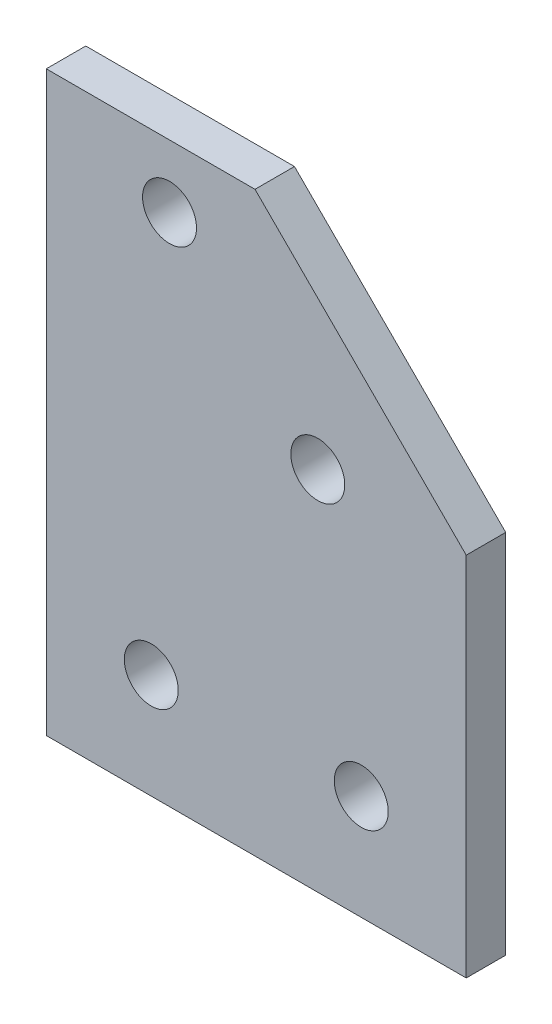
ISO-10303-21;
HEADER;
FILE_DESCRIPTION(('STEP AP214'),'2;1');
FILE_NAME('part.step','',(''),(''),'','','');
FILE_SCHEMA(('AUTOMOTIVE_DESIGN { 1 0 10303 214 1 1 1 1 }'));
ENDSEC;
DATA;
#1=APPLICATION_CONTEXT('core data for automotive mechanical design processes');
#2=APPLICATION_PROTOCOL_DEFINITION('international standard','automotive_design',2000,#1);
#3=PRODUCT_CONTEXT('',#1,'mechanical');
#4=PRODUCT('Part','Part','',(#3));
#5=PRODUCT_RELATED_PRODUCT_CATEGORY('part','',(#4));
#6=PRODUCT_DEFINITION_FORMATION('','',#4);
#7=PRODUCT_DEFINITION_CONTEXT('part definition',#1,'design');
#8=PRODUCT_DEFINITION('design','',#6,#7);
#9=PRODUCT_DEFINITION_SHAPE('','',#8);
#10=(LENGTH_UNIT() NAMED_UNIT(*) SI_UNIT(.MILLI.,.METRE.));
#11=(NAMED_UNIT(*) PLANE_ANGLE_UNIT() SI_UNIT($,.RADIAN.));
#12=(NAMED_UNIT(*) SI_UNIT($,.STERADIAN.) SOLID_ANGLE_UNIT());
#13=UNCERTAINTY_MEASURE_WITH_UNIT(LENGTH_MEASURE(1.E-05),#10,'distance_accuracy_value','');
#14=(GEOMETRIC_REPRESENTATION_CONTEXT(3) GLOBAL_UNCERTAINTY_ASSIGNED_CONTEXT((#13)) GLOBAL_UNIT_ASSIGNED_CONTEXT((#10,
#11,#12)) REPRESENTATION_CONTEXT('',''));
#15=CARTESIAN_POINT('',(0.,0.,0.));
#16=DIRECTION('',(0.,0.,1.));
#17=DIRECTION('',(1.,0.,0.));
#18=AXIS2_PLACEMENT_3D('',#15,#16,#17);
#19=CARTESIAN_POINT('',(25.4,-34.925,-2.3876));
#20=DIRECTION('',(1.,0.,0.));
#21=DIRECTION('',(0.,1.,0.));
#22=AXIS2_PLACEMENT_3D('',#19,#20,#21);
#23=PLANE('',#22);
#24=DIRECTION('',(0.,1.,0.));
#25=VECTOR('',#24,1.);
#26=CARTESIAN_POINT('',(25.4,-34.925,2.3876));
#27=LINE('',#26,#25);
#28=CARTESIAN_POINT('',(25.4,-34.925,2.3876));
#29=VERTEX_POINT('',#28);
#30=CARTESIAN_POINT('',(25.4,9.37259999999999,2.3876));
#31=VERTEX_POINT('',#30);
#32=EDGE_CURVE('E109',#29,#31,#27,.T.);
#33=ORIENTED_EDGE('',*,*,#32,.F.);
#34=DIRECTION('',(0.,0.,1.));
#35=VECTOR('',#34,1.);
#36=CARTESIAN_POINT('',(25.4,-34.925,-2.3876));
#37=LINE('',#36,#35);
#38=CARTESIAN_POINT('',(25.4,-34.925,-2.3876));
#39=VERTEX_POINT('',#38);
#40=EDGE_CURVE('E11',#39,#29,#37,.T.);
#41=ORIENTED_EDGE('',*,*,#40,.F.);
#42=DIRECTION('',(0.,1.,0.));
#43=VECTOR('',#42,1.);
#44=CARTESIAN_POINT('',(25.4,-34.925,-2.3876));
#45=LINE('',#44,#43);
#46=CARTESIAN_POINT('',(25.4,9.37259999999999,-2.3876));
#47=VERTEX_POINT('',#46);
#48=EDGE_CURVE('E104',#39,#47,#45,.T.);
#49=ORIENTED_EDGE('',*,*,#48,.T.);
#50=DIRECTION('',(0.,0.,1.));
#51=VECTOR('',#50,1.);
#52=CARTESIAN_POINT('',(25.4,9.37259999999999,-2.3876));
#53=LINE('',#52,#51);
#54=EDGE_CURVE('E35',#47,#31,#53,.T.);
#55=ORIENTED_EDGE('',*,*,#54,.T.);
#56=EDGE_LOOP('',(#33,#41,#49,#55));
#57=FACE_BOUND('',#56,.T.);
#58=ADVANCED_FACE('F32',(#57),#23,.T.);
#59=CARTESIAN_POINT('',(-25.4,-34.925,-2.3876));
#60=DIRECTION('',(0.,-1.,0.));
#61=DIRECTION('',(0.,0.,-1.));
#62=AXIS2_PLACEMENT_3D('',#59,#60,#61);
#63=PLANE('',#62);
#64=DIRECTION('',(1.,0.,0.));
#65=VECTOR('',#64,1.);
#66=CARTESIAN_POINT('',(-25.4,-34.925,2.3876));
#67=LINE('',#66,#65);
#68=CARTESIAN_POINT('',(-25.4,-34.925,2.3876));
#69=VERTEX_POINT('',#68);
#70=EDGE_CURVE('E119',#69,#29,#67,.T.);
#71=ORIENTED_EDGE('',*,*,#70,.F.);
#72=DIRECTION('',(0.,0.,1.));
#73=VECTOR('',#72,1.);
#74=CARTESIAN_POINT('',(-25.4,-34.925,-2.3876));
#75=LINE('',#74,#73);
#76=CARTESIAN_POINT('',(-25.4,-34.925,-2.3876));
#77=VERTEX_POINT('',#76);
#78=EDGE_CURVE('E41',#77,#69,#75,.T.);
#79=ORIENTED_EDGE('',*,*,#78,.F.);
#80=DIRECTION('',(1.,0.,0.));
#81=VECTOR('',#80,1.);
#82=CARTESIAN_POINT('',(-25.4,-34.925,-2.3876));
#83=LINE('',#82,#81);
#84=EDGE_CURVE('E99',#77,#39,#83,.T.);
#85=ORIENTED_EDGE('',*,*,#84,.T.);
#86=ORIENTED_EDGE('',*,*,#40,.T.);
#87=EDGE_LOOP('',(#71,#79,#85,#86));
#88=FACE_BOUND('',#87,.T.);
#89=ADVANCED_FACE('F125',(#88),#63,.T.);
#90=CARTESIAN_POINT('',(-25.4,34.925,-2.3876));
#91=DIRECTION('',(-1.,0.,0.));
#92=DIRECTION('',(0.,0.,1.));
#93=AXIS2_PLACEMENT_3D('',#90,#91,#92);
#94=PLANE('',#93);
#95=DIRECTION('',(0.,-1.,0.));
#96=VECTOR('',#95,1.);
#97=CARTESIAN_POINT('',(-25.4,34.925,2.3876));
#98=LINE('',#97,#96);
#99=CARTESIAN_POINT('',(-25.4,34.925,2.3876));
#100=VERTEX_POINT('',#99);
#101=EDGE_CURVE('E88',#100,#69,#98,.T.);
#102=ORIENTED_EDGE('',*,*,#101,.F.);
#103=DIRECTION('',(0.,0.,1.));
#104=VECTOR('',#103,1.);
#105=CARTESIAN_POINT('',(-25.4,34.925,-2.3876));
#106=LINE('',#105,#104);
#107=CARTESIAN_POINT('',(-25.4,34.925,-2.3876));
#108=VERTEX_POINT('',#107);
#109=EDGE_CURVE('E83',#108,#100,#106,.T.);
#110=ORIENTED_EDGE('',*,*,#109,.F.);
#111=DIRECTION('',(0.,-1.,0.));
#112=VECTOR('',#111,1.);
#113=CARTESIAN_POINT('',(-25.4,34.925,-2.3876));
#114=LINE('',#113,#112);
#115=EDGE_CURVE('E86',#108,#77,#114,.T.);
#116=ORIENTED_EDGE('',*,*,#115,.T.);
#117=ORIENTED_EDGE('',*,*,#78,.T.);
#118=EDGE_LOOP('',(#102,#110,#116,#117));
#119=FACE_BOUND('',#118,.T.);
#120=ADVANCED_FACE('F85',(#119),#94,.T.);
#121=CARTESIAN_POINT('',(-0.15239999999999,34.925,-2.3876));
#122=DIRECTION('',(0.,1.,0.));
#123=DIRECTION('',(0.,0.,1.));
#124=AXIS2_PLACEMENT_3D('',#121,#122,#123);
#125=PLANE('',#124);
#126=DIRECTION('',(-1.,0.,0.));
#127=VECTOR('',#126,1.);
#128=CARTESIAN_POINT('',(-0.15239999999999,34.925,2.3876));
#129=LINE('',#128,#127);
#130=CARTESIAN_POINT('',(-0.15239999999999,34.925,2.3876));
#131=VERTEX_POINT('',#130);
#132=EDGE_CURVE('E116',#131,#100,#129,.T.);
#133=ORIENTED_EDGE('',*,*,#132,.F.);
#134=DIRECTION('',(0.,0.,1.));
#135=VECTOR('',#134,1.);
#136=CARTESIAN_POINT('',(-0.15239999999999,34.925,-2.3876));
#137=LINE('',#136,#135);
#138=CARTESIAN_POINT('',(-0.15239999999999,34.925,-2.3876));
#139=VERTEX_POINT('',#138);
#140=EDGE_CURVE('E93',#139,#131,#137,.T.);
#141=ORIENTED_EDGE('',*,*,#140,.F.);
#142=DIRECTION('',(-1.,0.,0.));
#143=VECTOR('',#142,1.);
#144=CARTESIAN_POINT('',(-0.15239999999999,34.925,-2.3876));
#145=LINE('',#144,#143);
#146=EDGE_CURVE('E98',#139,#108,#145,.T.);
#147=ORIENTED_EDGE('',*,*,#146,.T.);
#148=ORIENTED_EDGE('',*,*,#109,.T.);
#149=EDGE_LOOP('',(#133,#141,#147,#148));
#150=FACE_BOUND('',#149,.T.);
#151=ADVANCED_FACE('F101',(#150),#125,.T.);
#152=CARTESIAN_POINT('',(25.4,9.37259999999999,-2.3876));
#153=DIRECTION('',(0.707106781186548,0.707106781186547,0.));
#154=DIRECTION('',(-0.707106781186547,0.707106781186548,0.));
#155=AXIS2_PLACEMENT_3D('',#152,#153,#154);
#156=PLANE('',#155);
#157=DIRECTION('',(-0.707106781186547,0.707106781186548,0.));
#158=VECTOR('',#157,1.);
#159=CARTESIAN_POINT('',(25.4,9.37259999999999,2.3876));
#160=LINE('',#159,#158);
#161=EDGE_CURVE('E112',#31,#131,#160,.T.);
#162=ORIENTED_EDGE('',*,*,#161,.F.);
#163=ORIENTED_EDGE('',*,*,#54,.F.);
#164=DIRECTION('',(-0.707106781186547,0.707106781186548,0.));
#165=VECTOR('',#164,1.);
#166=CARTESIAN_POINT('',(25.4,9.37259999999999,-2.3876));
#167=LINE('',#166,#165);
#168=EDGE_CURVE('E102',#47,#139,#167,.T.);
#169=ORIENTED_EDGE('',*,*,#168,.T.);
#170=ORIENTED_EDGE('',*,*,#140,.T.);
#171=EDGE_LOOP('',(#162,#163,#169,#170));
#172=FACE_BOUND('',#171,.T.);
#173=ADVANCED_FACE('F122',(#172),#156,.T.);
#174=CARTESIAN_POINT('',(0.,0.,-2.3876));
#175=DIRECTION('',(0.,0.,1.));
#176=DIRECTION('',(1.,0.,0.));
#177=AXIS2_PLACEMENT_3D('',#174,#175,#176);
#178=PLANE('',#177);
#179=CARTESIAN_POINT('',(12.7,-22.225,-2.3876));
#180=DIRECTION('',(0.,0.,1.));
#181=DIRECTION('',(-1.,0.,0.));
#182=AXIS2_PLACEMENT_3D('',#179,#180,#181);
#183=CIRCLE('',#182,3.26390000000001);
#184=CARTESIAN_POINT('',(9.4361,-22.225,-2.3876));
#185=VERTEX_POINT('',#184);
#186=EDGE_CURVE('E168',#185,#185,#183,.T.);
#187=ORIENTED_EDGE('',*,*,#186,.T.);
#188=EDGE_LOOP('',(#187));
#189=FACE_BOUND('',#188,.T.);
#190=CARTESIAN_POINT('',(7.44220000000001,9.37259999999999,-2.3876));
#191=DIRECTION('',(0.,0.,1.));
#192=DIRECTION('',(-1.,0.,0.));
#193=AXIS2_PLACEMENT_3D('',#190,#191,#192);
#194=CIRCLE('',#193,3.2639);
#195=CARTESIAN_POINT('',(4.1783,9.37259999999999,-2.3876));
#196=VERTEX_POINT('',#195);
#197=EDGE_CURVE('E176',#196,#196,#194,.T.);
#198=ORIENTED_EDGE('',*,*,#197,.T.);
#199=EDGE_LOOP('',(#198));
#200=FACE_BOUND('',#199,.T.);
#201=CARTESIAN_POINT('',(-12.7,-22.225,-2.3876));
#202=DIRECTION('',(0.,0.,1.));
#203=DIRECTION('',(-1.,0.,0.));
#204=AXIS2_PLACEMENT_3D('',#201,#202,#203);
#205=CIRCLE('',#204,3.2639);
#206=CARTESIAN_POINT('',(-15.9639,-22.225,-2.3876));
#207=VERTEX_POINT('',#206);
#208=EDGE_CURVE('E182',#207,#207,#205,.T.);
#209=ORIENTED_EDGE('',*,*,#208,.T.);
#210=EDGE_LOOP('',(#209));
#211=FACE_BOUND('',#210,.T.);
#212=CARTESIAN_POINT('',(-10.4902,27.3304,-2.3876));
#213=DIRECTION('',(0.,0.,1.));
#214=DIRECTION('',(-1.,0.,0.));
#215=AXIS2_PLACEMENT_3D('',#212,#213,#214);
#216=CIRCLE('',#215,3.2639);
#217=CARTESIAN_POINT('',(-13.7541,27.3304,-2.3876));
#218=VERTEX_POINT('',#217);
#219=EDGE_CURVE('E113',#218,#218,#216,.T.);
#220=ORIENTED_EDGE('',*,*,#219,.T.);
#221=EDGE_LOOP('',(#220));
#222=FACE_BOUND('',#221,.T.);
#223=ORIENTED_EDGE('',*,*,#48,.F.);
#224=ORIENTED_EDGE('',*,*,#84,.F.);
#225=ORIENTED_EDGE('',*,*,#115,.F.);
#226=ORIENTED_EDGE('',*,*,#146,.F.);
#227=ORIENTED_EDGE('',*,*,#168,.F.);
#228=EDGE_LOOP('',(#223,#224,#225,#226,#227));
#229=FACE_BOUND('',#228,.T.);
#230=ADVANCED_FACE('F97',(#189,#200,#211,#222,#229),#178,.F.);
#231=CARTESIAN_POINT('',(0.,0.,2.3876));
#232=DIRECTION('',(0.,0.,1.));
#233=DIRECTION('',(1.,0.,0.));
#234=AXIS2_PLACEMENT_3D('',#231,#232,#233);
#235=PLANE('',#234);
#236=CARTESIAN_POINT('',(12.7,-22.225,2.3876));
#237=DIRECTION('',(0.,0.,1.));
#238=DIRECTION('',(-1.,0.,0.));
#239=AXIS2_PLACEMENT_3D('',#236,#237,#238);
#240=CIRCLE('',#239,3.26390000000001);
#241=CARTESIAN_POINT('',(9.4361,-22.225,2.3876));
#242=VERTEX_POINT('',#241);
#243=EDGE_CURVE('E171',#242,#242,#240,.T.);
#244=ORIENTED_EDGE('',*,*,#243,.F.);
#245=EDGE_LOOP('',(#244));
#246=FACE_BOUND('',#245,.T.);
#247=CARTESIAN_POINT('',(7.44220000000001,9.37259999999999,2.3876));
#248=DIRECTION('',(0.,0.,1.));
#249=DIRECTION('',(-1.,0.,0.));
#250=AXIS2_PLACEMENT_3D('',#247,#248,#249);
#251=CIRCLE('',#250,3.2639);
#252=CARTESIAN_POINT('',(4.1783,9.37259999999999,2.3876));
#253=VERTEX_POINT('',#252);
#254=EDGE_CURVE('E173',#253,#253,#251,.T.);
#255=ORIENTED_EDGE('',*,*,#254,.F.);
#256=EDGE_LOOP('',(#255));
#257=FACE_BOUND('',#256,.T.);
#258=CARTESIAN_POINT('',(-12.7,-22.225,2.3876));
#259=DIRECTION('',(0.,0.,1.));
#260=DIRECTION('',(-1.,0.,0.));
#261=AXIS2_PLACEMENT_3D('',#258,#259,#260);
#262=CIRCLE('',#261,3.2639);
#263=CARTESIAN_POINT('',(-15.9639,-22.225,2.3876));
#264=VERTEX_POINT('',#263);
#265=EDGE_CURVE('E179',#264,#264,#262,.T.);
#266=ORIENTED_EDGE('',*,*,#265,.F.);
#267=EDGE_LOOP('',(#266));
#268=FACE_BOUND('',#267,.T.);
#269=CARTESIAN_POINT('',(-10.4902,27.3304,2.3876));
#270=DIRECTION('',(0.,0.,1.));
#271=DIRECTION('',(-1.,0.,0.));
#272=AXIS2_PLACEMENT_3D('',#269,#270,#271);
#273=CIRCLE('',#272,3.2639);
#274=CARTESIAN_POINT('',(-13.7541,27.3304,2.3876));
#275=VERTEX_POINT('',#274);
#276=EDGE_CURVE('E185',#275,#275,#273,.T.);
#277=ORIENTED_EDGE('',*,*,#276,.F.);
#278=EDGE_LOOP('',(#277));
#279=FACE_BOUND('',#278,.T.);
#280=ORIENTED_EDGE('',*,*,#32,.T.);
#281=ORIENTED_EDGE('',*,*,#161,.T.);
#282=ORIENTED_EDGE('',*,*,#132,.T.);
#283=ORIENTED_EDGE('',*,*,#101,.T.);
#284=ORIENTED_EDGE('',*,*,#70,.T.);
#285=EDGE_LOOP('',(#280,#281,#282,#283,#284));
#286=FACE_BOUND('',#285,.T.);
#287=ADVANCED_FACE('F124',(#246,#257,#268,#279,#286),#235,.T.);
#288=CARTESIAN_POINT('',(-10.4902,27.3304,-2.3876));
#289=DIRECTION('',(0.,0.,1.));
#290=DIRECTION('',(1.,0.,0.));
#291=AXIS2_PLACEMENT_3D('',#288,#289,#290);
#292=CYLINDRICAL_SURFACE('',#291,3.2639);
#293=ORIENTED_EDGE('',*,*,#219,.F.);
#294=EDGE_LOOP('',(#293));
#295=FACE_BOUND('',#294,.T.);
#296=ORIENTED_EDGE('',*,*,#276,.T.);
#297=EDGE_LOOP('',(#296));
#298=FACE_BOUND('',#297,.T.);
#299=ADVANCED_FACE('F145',(#295,#298),#292,.F.);
#300=CARTESIAN_POINT('',(-12.7,-22.225,-2.3876));
#301=DIRECTION('',(0.,0.,1.));
#302=DIRECTION('',(1.,0.,0.));
#303=AXIS2_PLACEMENT_3D('',#300,#301,#302);
#304=CYLINDRICAL_SURFACE('',#303,3.2639);
#305=ORIENTED_EDGE('',*,*,#208,.F.);
#306=EDGE_LOOP('',(#305));
#307=FACE_BOUND('',#306,.T.);
#308=ORIENTED_EDGE('',*,*,#265,.T.);
#309=EDGE_LOOP('',(#308));
#310=FACE_BOUND('',#309,.T.);
#311=ADVANCED_FACE('F152',(#307,#310),#304,.F.);
#312=CARTESIAN_POINT('',(7.44220000000001,9.37259999999999,-2.3876));
#313=DIRECTION('',(0.,0.,1.));
#314=DIRECTION('',(1.,0.,0.));
#315=AXIS2_PLACEMENT_3D('',#312,#313,#314);
#316=CYLINDRICAL_SURFACE('',#315,3.2639);
#317=ORIENTED_EDGE('',*,*,#197,.F.);
#318=EDGE_LOOP('',(#317));
#319=FACE_BOUND('',#318,.T.);
#320=ORIENTED_EDGE('',*,*,#254,.T.);
#321=EDGE_LOOP('',(#320));
#322=FACE_BOUND('',#321,.T.);
#323=ADVANCED_FACE('F156',(#319,#322),#316,.F.);
#324=CARTESIAN_POINT('',(12.7,-22.225,-2.3876));
#325=DIRECTION('',(0.,0.,1.));
#326=DIRECTION('',(1.,0.,0.));
#327=AXIS2_PLACEMENT_3D('',#324,#325,#326);
#328=CYLINDRICAL_SURFACE('',#327,3.26390000000001);
#329=ORIENTED_EDGE('',*,*,#186,.F.);
#330=EDGE_LOOP('',(#329));
#331=FACE_BOUND('',#330,.T.);
#332=ORIENTED_EDGE('',*,*,#243,.T.);
#333=EDGE_LOOP('',(#332));
#334=FACE_BOUND('',#333,.T.);
#335=ADVANCED_FACE('F160',(#331,#334),#328,.F.);
#336=CLOSED_SHELL('',(#58,#89,#120,#151,#173,#230,#287,#299,#311,#323,#335));
#337=MANIFOLD_SOLID_BREP('B2',#336);
#338=ADVANCED_BREP_SHAPE_REPRESENTATION('',(#18,#337),#14);
#339=SHAPE_DEFINITION_REPRESENTATION(#9,#338);
ENDSEC;
END-ISO-10303-21;
